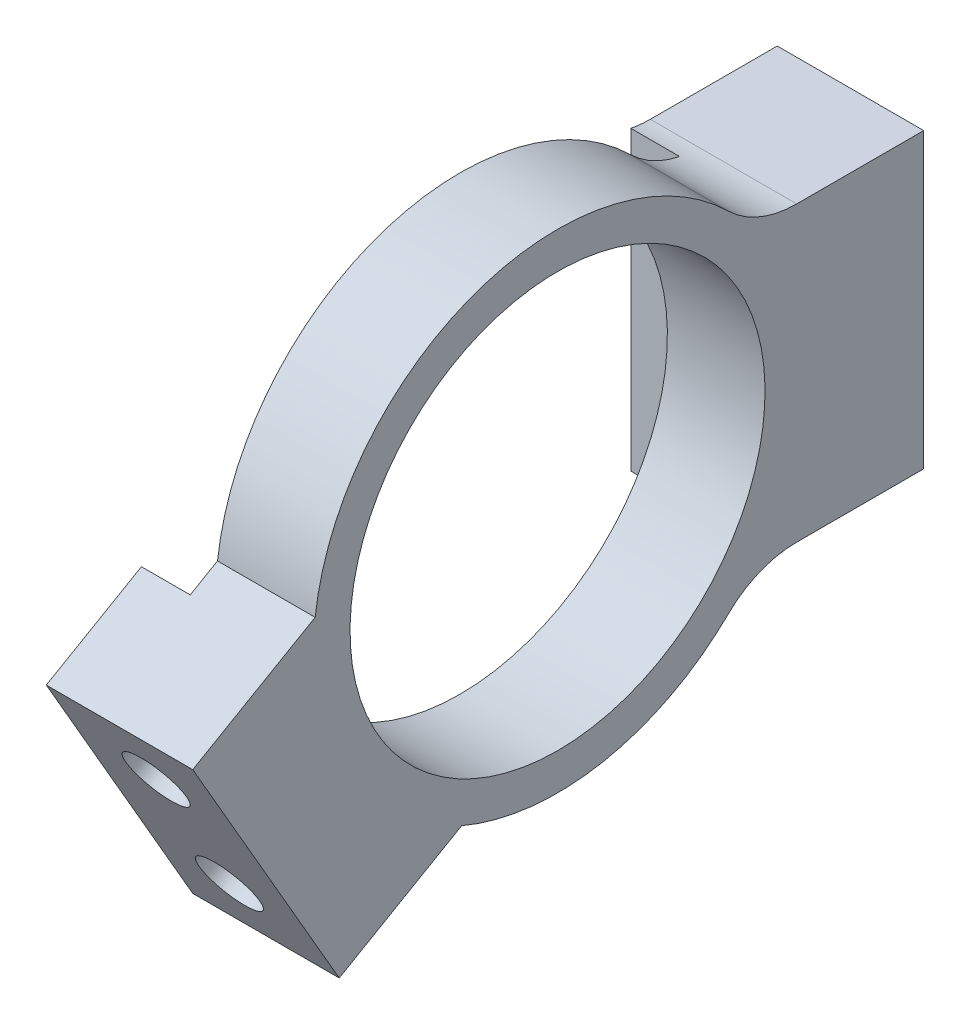
ISO-10303-21;
HEADER;
FILE_DESCRIPTION(('STEP AP214'),'2;1');
FILE_NAME('part.step','',(''),(''),'','','');
FILE_SCHEMA(('AUTOMOTIVE_DESIGN { 1 0 10303 214 1 1 1 1 }'));
ENDSEC;
DATA;
#1=APPLICATION_CONTEXT('core data for automotive mechanical design processes');
#2=APPLICATION_PROTOCOL_DEFINITION('international standard','automotive_design',2000,#1);
#3=PRODUCT_CONTEXT('',#1,'mechanical');
#4=PRODUCT('Part','Part','',(#3));
#5=PRODUCT_RELATED_PRODUCT_CATEGORY('part','',(#4));
#6=PRODUCT_DEFINITION_FORMATION('','',#4);
#7=PRODUCT_DEFINITION_CONTEXT('part definition',#1,'design');
#8=PRODUCT_DEFINITION('design','',#6,#7);
#9=PRODUCT_DEFINITION_SHAPE('','',#8);
#10=(LENGTH_UNIT() NAMED_UNIT(*) SI_UNIT(.MILLI.,.METRE.));
#11=(NAMED_UNIT(*) PLANE_ANGLE_UNIT() SI_UNIT($,.RADIAN.));
#12=(NAMED_UNIT(*) SI_UNIT($,.STERADIAN.) SOLID_ANGLE_UNIT());
#13=UNCERTAINTY_MEASURE_WITH_UNIT(LENGTH_MEASURE(1.E-05),#10,'distance_accuracy_value','');
#14=(GEOMETRIC_REPRESENTATION_CONTEXT(3) GLOBAL_UNCERTAINTY_ASSIGNED_CONTEXT((#13)) GLOBAL_UNIT_ASSIGNED_CONTEXT((#10,
#11,#12)) REPRESENTATION_CONTEXT('',''));
#15=CARTESIAN_POINT('',(0.,0.,0.));
#16=DIRECTION('',(0.,0.,1.));
#17=DIRECTION('',(1.,0.,0.));
#18=AXIS2_PLACEMENT_3D('',#15,#16,#17);
#19=CARTESIAN_POINT('',(-2.,4.3,7.));
#20=DIRECTION('',(1.,0.,0.));
#21=DIRECTION('',(0.,1.,0.));
#22=AXIS2_PLACEMENT_3D('',#19,#20,#21);
#23=PLANE('',#22);
#24=CARTESIAN_POINT('',(-2.,0.,15.));
#25=DIRECTION('',(-1.,0.,0.));
#26=DIRECTION('',(0.,-1.,0.));
#27=AXIS2_PLACEMENT_3D('',#24,#25,#26);
#28=CIRCLE('',#27,8.5);
#29=CARTESIAN_POINT('',(-2.,-8.5,15.));
#30=VERTEX_POINT('',#29);
#31=EDGE_CURVE('E180',#30,#30,#28,.T.);
#32=ORIENTED_EDGE('',*,*,#31,.F.);
#33=EDGE_LOOP('',(#32));
#34=FACE_BOUND('',#33,.T.);
#35=DIRECTION('',(0.,-0.866025403784439,-0.5));
#36=VECTOR('',#35,1.);
#37=CARTESIAN_POINT('',(-2.,0.551152422706631,26.0453760011574));
#38=LINE('',#37,#36);
#39=CARTESIAN_POINT('',(-2.,0.551152422706631,26.0453760011574));
#40=VERTEX_POINT('',#39);
#41=CARTESIAN_POINT('',(-2.,-9.84115242270664,20.0453760011574));
#42=VERTEX_POINT('',#41);
#43=EDGE_CURVE('E152',#40,#42,#38,.T.);
#44=ORIENTED_EDGE('',*,*,#43,.F.);
#45=DIRECTION('',(0.,0.5,-0.866025403784438));
#46=VECTOR('',#45,1.);
#47=CARTESIAN_POINT('',(-2.,-2.88750147344268,32.0012992589327));
#48=LINE('',#47,#46);
#49=CARTESIAN_POINT('',(-2.,1.19615242270663,24.9282032302755));
#50=VERTEX_POINT('',#49);
#51=EDGE_CURVE('E139',#40,#50,#48,.T.);
#52=ORIENTED_EDGE('',*,*,#51,.T.);
#53=CARTESIAN_POINT('',(-2.,0.,15.));
#54=DIRECTION('',(1.,0.,0.));
#55=DIRECTION('',(0.,1.,0.));
#56=AXIS2_PLACEMENT_3D('',#53,#54,#55);
#57=CIRCLE('',#56,10.);
#58=CARTESIAN_POINT('',(-2.,7.14285714285714,8.00145787776235));
#59=VERTEX_POINT('',#58);
#60=EDGE_CURVE('E187',#59,#50,#57,.T.);
#61=ORIENTED_EDGE('',*,*,#60,.F.);
#62=CARTESIAN_POINT('',(-2.,10.,5.20204102886729));
#63=DIRECTION('',(1.,0.,0.));
#64=DIRECTION('',(0.,1.,0.));
#65=AXIS2_PLACEMENT_3D('',#62,#63,#64);
#66=CIRCLE('',#65,4.);
#67=CARTESIAN_POINT('',(-2.,6.08040034182203,6.));
#68=VERTEX_POINT('',#67);
#69=EDGE_CURVE('E241',#59,#68,#66,.T.);
#70=ORIENTED_EDGE('',*,*,#69,.T.);
#71=DIRECTION('',(0.,-1.,0.));
#72=VECTOR('',#71,1.);
#73=CARTESIAN_POINT('',(-2.,4.3,6.));
#74=LINE('',#73,#72);
#75=CARTESIAN_POINT('',(-2.,-6.08040034182203,6.));
#76=VERTEX_POINT('',#75);
#77=EDGE_CURVE('E203',#68,#76,#74,.T.);
#78=ORIENTED_EDGE('',*,*,#77,.T.);
#79=CARTESIAN_POINT('',(-2.,-10.,5.20204102886729));
#80=DIRECTION('',(1.,0.,0.));
#81=DIRECTION('',(0.,1.,0.));
#82=AXIS2_PLACEMENT_3D('',#79,#80,#81);
#83=CIRCLE('',#82,4.);
#84=CARTESIAN_POINT('',(-2.,-7.14285714285714,8.00145787776235));
#85=VERTEX_POINT('',#84);
#86=EDGE_CURVE('E11',#76,#85,#83,.T.);
#87=ORIENTED_EDGE('',*,*,#86,.T.);
#88=CARTESIAN_POINT('',(-2.,-9.19615242270664,18.9282032302755));
#89=VERTEX_POINT('',#88);
#90=EDGE_CURVE('E190',#89,#85,#57,.T.);
#91=ORIENTED_EDGE('',*,*,#90,.F.);
#92=DIRECTION('',(0.,0.5,-0.866025403784439));
#93=VECTOR('',#92,1.);
#94=CARTESIAN_POINT('',(-2.,-13.2798063188559,26.0012992589327));
#95=LINE('',#94,#93);
#96=EDGE_CURVE('E51',#42,#89,#95,.T.);
#97=ORIENTED_EDGE('',*,*,#96,.F.);
#98=EDGE_LOOP('',(#44,#52,#61,#70,#78,#87,#91,#97));
#99=FACE_BOUND('',#98,.T.);
#100=ADVANCED_FACE('F36',(#34,#99),#23,.F.);
#101=CARTESIAN_POINT('',(-2.,0.,15.));
#102=DIRECTION('',(1.,0.,0.));
#103=DIRECTION('',(0.,1.,0.));
#104=AXIS2_PLACEMENT_3D('',#101,#102,#103);
#105=CYLINDRICAL_SURFACE('',#104,10.);
#106=CARTESIAN_POINT('',(2.,0.,15.));
#107=DIRECTION('',(1.,0.,0.));
#108=DIRECTION('',(0.,1.,0.));
#109=AXIS2_PLACEMENT_3D('',#106,#107,#108);
#110=CIRCLE('',#109,10.);
#111=CARTESIAN_POINT('',(2.,-9.19615242270664,18.9282032302755));
#112=VERTEX_POINT('',#111);
#113=CARTESIAN_POINT('',(2.,-7.14285714285714,8.00145787776235));
#114=VERTEX_POINT('',#113);
#115=EDGE_CURVE('E186',#112,#114,#110,.T.);
#116=ORIENTED_EDGE('',*,*,#115,.F.);
#117=DIRECTION('',(-1.,0.,0.));
#118=VECTOR('',#117,1.);
#119=CARTESIAN_POINT('',(19.2588235436221,-9.19615242270663,18.9282032302755));
#120=LINE('',#119,#118);
#121=EDGE_CURVE('E58',#112,#89,#120,.T.);
#122=ORIENTED_EDGE('',*,*,#121,.T.);
#123=ORIENTED_EDGE('',*,*,#90,.T.);
#124=DIRECTION('',(1.,0.,0.));
#125=VECTOR('',#124,1.);
#126=CARTESIAN_POINT('',(-2.,-7.14285714285714,8.00145787776235));
#127=LINE('',#126,#125);
#128=EDGE_CURVE('E232',#85,#114,#127,.T.);
#129=ORIENTED_EDGE('',*,*,#128,.T.);
#130=EDGE_LOOP('',(#116,#122,#123,#129));
#131=FACE_BOUND('',#130,.T.);
#132=ADVANCED_FACE('F290',(#131),#105,.T.);
#133=CARTESIAN_POINT('',(-4.,-6.,6.));
#134=DIRECTION('',(0.,0.,1.));
#135=DIRECTION('',(1.,0.,0.));
#136=AXIS2_PLACEMENT_3D('',#133,#134,#135);
#137=PLANE('',#136);
#138=DIRECTION('',(0.,-1.,0.));
#139=VECTOR('',#138,1.);
#140=CARTESIAN_POINT('',(-4.,6.,6.));
#141=LINE('',#140,#139);
#142=CARTESIAN_POINT('',(-4.,6.08040034182203,6.));
#143=VERTEX_POINT('',#142);
#144=CARTESIAN_POINT('',(-4.,-6.08040034182203,6.));
#145=VERTEX_POINT('',#144);
#146=EDGE_CURVE('E208',#143,#145,#141,.T.);
#147=ORIENTED_EDGE('',*,*,#146,.T.);
#148=DIRECTION('',(1.,0.,0.));
#149=VECTOR('',#148,1.);
#150=CARTESIAN_POINT('',(-4.,-6.08040034182203,6.));
#151=LINE('',#150,#149);
#152=EDGE_CURVE('E44',#145,#76,#151,.T.);
#153=ORIENTED_EDGE('',*,*,#152,.T.);
#154=ORIENTED_EDGE('',*,*,#77,.F.);
#155=DIRECTION('',(1.,0.,0.));
#156=VECTOR('',#155,1.);
#157=CARTESIAN_POINT('',(-2.,6.08040034182203,6.));
#158=LINE('',#157,#156);
#159=EDGE_CURVE('E244',#68,#143,#158,.F.);
#160=ORIENTED_EDGE('',*,*,#159,.T.);
#161=EDGE_LOOP('',(#147,#153,#154,#160));
#162=FACE_BOUND('',#161,.T.);
#163=ADVANCED_FACE('F257',(#162),#137,.T.);
#164=CARTESIAN_POINT('',(-4.,6.,6.));
#165=DIRECTION('',(1.,0.,0.));
#166=DIRECTION('',(0.,1.,0.));
#167=AXIS2_PLACEMENT_3D('',#164,#165,#166);
#168=PLANE('',#167);
#169=DIRECTION('',(0.,-1.,0.));
#170=VECTOR('',#169,1.);
#171=CARTESIAN_POINT('',(-4.,6.,0.));
#172=LINE('',#171,#170);
#173=CARTESIAN_POINT('',(-4.,6.,0.));
#174=VERTEX_POINT('',#173);
#175=CARTESIAN_POINT('',(-4.,-6.,0.));
#176=VERTEX_POINT('',#175);
#177=EDGE_CURVE('E207',#174,#176,#172,.T.);
#178=ORIENTED_EDGE('',*,*,#177,.T.);
#179=DIRECTION('',(0.,0.,-1.));
#180=VECTOR('',#179,1.);
#181=CARTESIAN_POINT('',(-4.,-6.,6.));
#182=LINE('',#181,#180);
#183=CARTESIAN_POINT('',(-4.,-6.,5.20204102886729));
#184=VERTEX_POINT('',#183);
#185=EDGE_CURVE('E227',#184,#176,#182,.T.);
#186=ORIENTED_EDGE('',*,*,#185,.F.);
#187=CARTESIAN_POINT('',(-4.,-10.,5.20204102886729));
#188=DIRECTION('',(1.,0.,0.));
#189=DIRECTION('',(0.,1.,0.));
#190=AXIS2_PLACEMENT_3D('',#187,#188,#189);
#191=CIRCLE('',#190,4.);
#192=EDGE_CURVE('E251',#184,#145,#191,.T.);
#193=ORIENTED_EDGE('',*,*,#192,.T.);
#194=ORIENTED_EDGE('',*,*,#146,.F.);
#195=CARTESIAN_POINT('',(-4.,10.,5.20204102886729));
#196=DIRECTION('',(1.,0.,0.));
#197=DIRECTION('',(0.,1.,0.));
#198=AXIS2_PLACEMENT_3D('',#195,#196,#197);
#199=CIRCLE('',#198,4.);
#200=CARTESIAN_POINT('',(-4.,6.,5.20204102886729));
#201=VERTEX_POINT('',#200);
#202=EDGE_CURVE('E247',#143,#201,#199,.T.);
#203=ORIENTED_EDGE('',*,*,#202,.T.);
#204=DIRECTION('',(0.,0.,-1.));
#205=VECTOR('',#204,1.);
#206=CARTESIAN_POINT('',(-4.,6.,6.));
#207=LINE('',#206,#205);
#208=EDGE_CURVE('E210',#201,#174,#207,.T.);
#209=ORIENTED_EDGE('',*,*,#208,.T.);
#210=EDGE_LOOP('',(#178,#186,#193,#194,#203,#209));
#211=FACE_BOUND('',#210,.T.);
#212=ADVANCED_FACE('F271',(#211),#168,.F.);
#213=CARTESIAN_POINT('',(-4.,-6.,6.));
#214=DIRECTION('',(0.,1.,0.));
#215=DIRECTION('',(0.,0.,1.));
#216=AXIS2_PLACEMENT_3D('',#213,#214,#215);
#217=PLANE('',#216);
#218=DIRECTION('',(0.,0.,-1.));
#219=VECTOR('',#218,1.);
#220=CARTESIAN_POINT('',(2.,-6.,6.));
#221=LINE('',#220,#219);
#222=CARTESIAN_POINT('',(2.,-6.,5.20204102886729));
#223=VERTEX_POINT('',#222);
#224=CARTESIAN_POINT('',(2.,-6.,0.));
#225=VERTEX_POINT('',#224);
#226=EDGE_CURVE('E225',#223,#225,#221,.T.);
#227=ORIENTED_EDGE('',*,*,#226,.F.);
#228=DIRECTION('',(1.,0.,0.));
#229=VECTOR('',#228,1.);
#230=CARTESIAN_POINT('',(-4.,-6.,5.20204102886729));
#231=LINE('',#230,#229);
#232=EDGE_CURVE('E237',#223,#184,#231,.F.);
#233=ORIENTED_EDGE('',*,*,#232,.T.);
#234=ORIENTED_EDGE('',*,*,#185,.T.);
#235=DIRECTION('',(1.,0.,0.));
#236=VECTOR('',#235,1.);
#237=CARTESIAN_POINT('',(-4.,-6.,0.));
#238=LINE('',#237,#236);
#239=EDGE_CURVE('E214',#176,#225,#238,.T.);
#240=ORIENTED_EDGE('',*,*,#239,.T.);
#241=EDGE_LOOP('',(#227,#233,#234,#240));
#242=FACE_BOUND('',#241,.T.);
#243=ADVANCED_FACE('F285',(#242),#217,.F.);
#244=CARTESIAN_POINT('',(2.,6.,6.));
#245=DIRECTION('',(-1.,0.,0.));
#246=DIRECTION('',(0.,-1.,0.));
#247=AXIS2_PLACEMENT_3D('',#244,#245,#246);
#248=PLANE('',#247);
#249=CARTESIAN_POINT('',(2.,0.,15.));
#250=DIRECTION('',(-1.,0.,0.));
#251=DIRECTION('',(0.,-1.,0.));
#252=AXIS2_PLACEMENT_3D('',#249,#250,#251);
#253=CIRCLE('',#252,8.5);
#254=CARTESIAN_POINT('',(2.,-8.5,15.));
#255=VERTEX_POINT('',#254);
#256=EDGE_CURVE('E183',#255,#255,#253,.F.);
#257=ORIENTED_EDGE('',*,*,#256,.F.);
#258=EDGE_LOOP('',(#257));
#259=FACE_BOUND('',#258,.T.);
#260=DIRECTION('',(0.,0.,-1.));
#261=VECTOR('',#260,1.);
#262=CARTESIAN_POINT('',(2.,6.,6.));
#263=LINE('',#262,#261);
#264=CARTESIAN_POINT('',(2.,6.,5.20204102886729));
#265=VERTEX_POINT('',#264);
#266=CARTESIAN_POINT('',(2.,6.,0.));
#267=VERTEX_POINT('',#266);
#268=EDGE_CURVE('E223',#265,#267,#263,.T.);
#269=ORIENTED_EDGE('',*,*,#268,.F.);
#270=CARTESIAN_POINT('',(2.,10.,5.20204102886729));
#271=DIRECTION('',(-1.,0.,0.));
#272=DIRECTION('',(0.,-1.,0.));
#273=AXIS2_PLACEMENT_3D('',#270,#271,#272);
#274=CIRCLE('',#273,4.);
#275=CARTESIAN_POINT('',(2.,7.14285714285714,8.00145787776235));
#276=VERTEX_POINT('',#275);
#277=EDGE_CURVE('E239',#265,#276,#274,.T.);
#278=ORIENTED_EDGE('',*,*,#277,.T.);
#279=CARTESIAN_POINT('',(2.,1.19615242270663,24.9282032302755));
#280=VERTEX_POINT('',#279);
#281=EDGE_CURVE('E191',#276,#280,#110,.T.);
#282=ORIENTED_EDGE('',*,*,#281,.T.);
#283=DIRECTION('',(0.,-0.5,0.866025403784438));
#284=VECTOR('',#283,1.);
#285=CARTESIAN_POINT('',(2.,-2.88750147344268,32.0012992589327));
#286=LINE('',#285,#284);
#287=CARTESIAN_POINT('',(2.,-1.69884757729337,29.9424903181874));
#288=VERTEX_POINT('',#287);
#289=EDGE_CURVE('E171',#280,#288,#286,.T.);
#290=ORIENTED_EDGE('',*,*,#289,.T.);
#291=DIRECTION('',(0.,0.866025403784438,0.5));
#292=VECTOR('',#291,1.);
#293=CARTESIAN_POINT('',(2.,-26.4387261363955,15.6589147723711));
#294=LINE('',#293,#292);
#295=CARTESIAN_POINT('',(2.,-12.0911524227066,23.9424903181874));
#296=VERTEX_POINT('',#295);
#297=EDGE_CURVE('E168',#296,#288,#294,.T.);
#298=ORIENTED_EDGE('',*,*,#297,.F.);
#299=DIRECTION('',(0.,-0.5,0.866025403784439));
#300=VECTOR('',#299,1.);
#301=CARTESIAN_POINT('',(2.,-13.2798063188559,26.0012992589327));
#302=LINE('',#301,#300);
#303=EDGE_CURVE('E166',#112,#296,#302,.T.);
#304=ORIENTED_EDGE('',*,*,#303,.F.);
#305=ORIENTED_EDGE('',*,*,#115,.T.);
#306=CARTESIAN_POINT('',(2.,-10.,5.20204102886729));
#307=DIRECTION('',(-1.,0.,0.));
#308=DIRECTION('',(0.,-1.,0.));
#309=AXIS2_PLACEMENT_3D('',#306,#307,#308);
#310=CIRCLE('',#309,4.);
#311=EDGE_CURVE('E249',#114,#223,#310,.T.);
#312=ORIENTED_EDGE('',*,*,#311,.T.);
#313=ORIENTED_EDGE('',*,*,#226,.T.);
#314=DIRECTION('',(0.,1.,0.));
#315=VECTOR('',#314,1.);
#316=CARTESIAN_POINT('',(2.,6.,0.));
#317=LINE('',#316,#315);
#318=EDGE_CURVE('E217',#225,#267,#317,.T.);
#319=ORIENTED_EDGE('',*,*,#318,.T.);
#320=EDGE_LOOP('',(#269,#278,#282,#290,#298,#304,#305,#312,#313,#319));
#321=FACE_BOUND('',#320,.T.);
#322=ADVANCED_FACE('F287',(#259,#321),#248,.F.);
#323=CARTESIAN_POINT('',(-4.,6.,6.));
#324=DIRECTION('',(0.,-1.,0.));
#325=DIRECTION('',(0.,0.,-1.));
#326=AXIS2_PLACEMENT_3D('',#323,#324,#325);
#327=PLANE('',#326);
#328=ORIENTED_EDGE('',*,*,#208,.F.);
#329=DIRECTION('',(1.,0.,0.));
#330=VECTOR('',#329,1.);
#331=CARTESIAN_POINT('',(-4.,6.,5.20204102886729));
#332=LINE('',#331,#330);
#333=EDGE_CURVE('E229',#201,#265,#332,.T.);
#334=ORIENTED_EDGE('',*,*,#333,.T.);
#335=ORIENTED_EDGE('',*,*,#268,.T.);
#336=DIRECTION('',(-1.,0.,0.));
#337=VECTOR('',#336,1.);
#338=CARTESIAN_POINT('',(-4.,6.,0.));
#339=LINE('',#338,#337);
#340=EDGE_CURVE('E211',#267,#174,#339,.T.);
#341=ORIENTED_EDGE('',*,*,#340,.T.);
#342=EDGE_LOOP('',(#328,#334,#335,#341));
#343=FACE_BOUND('',#342,.T.);
#344=ADVANCED_FACE('F273',(#343),#327,.F.);
#345=CARTESIAN_POINT('',(-4.,-6.,0.));
#346=DIRECTION('',(0.,0.,1.));
#347=DIRECTION('',(1.,0.,0.));
#348=AXIS2_PLACEMENT_3D('',#345,#346,#347);
#349=PLANE('',#348);
#350=CARTESIAN_POINT('',(-1.,-3.,0.));
#351=DIRECTION('',(0.,0.,-1.));
#352=DIRECTION('',(-1.,0.,0.));
#353=AXIS2_PLACEMENT_3D('',#350,#351,#352);
#354=CIRCLE('',#353,1.25);
#355=CARTESIAN_POINT('',(-2.25,-3.,0.));
#356=VERTEX_POINT('',#355);
#357=EDGE_CURVE('E189',#356,#356,#354,.T.);
#358=ORIENTED_EDGE('',*,*,#357,.F.);
#359=EDGE_LOOP('',(#358));
#360=FACE_BOUND('',#359,.T.);
#361=CARTESIAN_POINT('',(-1.,3.,0.));
#362=DIRECTION('',(0.,0.,-1.));
#363=DIRECTION('',(-1.,0.,0.));
#364=AXIS2_PLACEMENT_3D('',#361,#362,#363);
#365=CIRCLE('',#364,1.25);
#366=CARTESIAN_POINT('',(-2.25,3.,0.));
#367=VERTEX_POINT('',#366);
#368=EDGE_CURVE('E197',#367,#367,#365,.T.);
#369=ORIENTED_EDGE('',*,*,#368,.F.);
#370=EDGE_LOOP('',(#369));
#371=FACE_BOUND('',#370,.T.);
#372=ORIENTED_EDGE('',*,*,#177,.F.);
#373=ORIENTED_EDGE('',*,*,#340,.F.);
#374=ORIENTED_EDGE('',*,*,#318,.F.);
#375=ORIENTED_EDGE('',*,*,#239,.F.);
#376=EDGE_LOOP('',(#372,#373,#374,#375));
#377=FACE_BOUND('',#376,.T.);
#378=ADVANCED_FACE('F280',(#360,#371,#377),#349,.F.);
#379=CARTESIAN_POINT('',(-1.,3.,5.5));
#380=DIRECTION('',(0.,0.,-1.));
#381=DIRECTION('',(-1.,0.,0.));
#382=AXIS2_PLACEMENT_3D('',#379,#380,#381);
#383=CYLINDRICAL_SURFACE('',#382,1.25);
#384=CARTESIAN_POINT('',(-1.,3.,5.5));
#385=DIRECTION('',(0.,0.,-1.));
#386=DIRECTION('',(-1.,0.,0.));
#387=AXIS2_PLACEMENT_3D('',#384,#385,#386);
#388=CIRCLE('',#387,1.25);
#389=CARTESIAN_POINT('',(-2.25,3.,5.5));
#390=VERTEX_POINT('',#389);
#391=EDGE_CURVE('E200',#390,#390,#388,.T.);
#392=ORIENTED_EDGE('',*,*,#391,.F.);
#393=EDGE_LOOP('',(#392));
#394=FACE_BOUND('',#393,.T.);
#395=ORIENTED_EDGE('',*,*,#368,.T.);
#396=EDGE_LOOP('',(#395));
#397=FACE_BOUND('',#396,.T.);
#398=ADVANCED_FACE('F428',(#394,#397),#383,.F.);
#399=CARTESIAN_POINT('',(-1.,3.,5.5));
#400=DIRECTION('',(0.,0.,-1.));
#401=DIRECTION('',(-1.,0.,0.));
#402=AXIS2_PLACEMENT_3D('',#399,#400,#401);
#403=PLANE('',#402);
#404=ORIENTED_EDGE('',*,*,#391,.T.);
#405=EDGE_LOOP('',(#404));
#406=FACE_BOUND('',#405,.T.);
#407=ADVANCED_FACE('F433',(#406),#403,.T.);
#408=CARTESIAN_POINT('',(-1.,-3.,5.5));
#409=DIRECTION('',(0.,0.,-1.));
#410=DIRECTION('',(-1.,0.,0.));
#411=AXIS2_PLACEMENT_3D('',#408,#409,#410);
#412=CYLINDRICAL_SURFACE('',#411,1.25);
#413=CARTESIAN_POINT('',(-1.,-3.,5.5));
#414=DIRECTION('',(0.,0.,-1.));
#415=DIRECTION('',(-1.,0.,0.));
#416=AXIS2_PLACEMENT_3D('',#413,#414,#415);
#417=CIRCLE('',#416,1.25);
#418=CARTESIAN_POINT('',(-2.25,-3.,5.5));
#419=VERTEX_POINT('',#418);
#420=EDGE_CURVE('E194',#419,#419,#417,.T.);
#421=ORIENTED_EDGE('',*,*,#420,.F.);
#422=EDGE_LOOP('',(#421));
#423=FACE_BOUND('',#422,.T.);
#424=ORIENTED_EDGE('',*,*,#357,.T.);
#425=EDGE_LOOP('',(#424));
#426=FACE_BOUND('',#425,.T.);
#427=ADVANCED_FACE('F312',(#423,#426),#412,.F.);
#428=CARTESIAN_POINT('',(-1.,-3.,5.5));
#429=DIRECTION('',(0.,0.,-1.));
#430=DIRECTION('',(-1.,0.,0.));
#431=AXIS2_PLACEMENT_3D('',#428,#429,#430);
#432=PLANE('',#431);
#433=ORIENTED_EDGE('',*,*,#420,.T.);
#434=EDGE_LOOP('',(#433));
#435=FACE_BOUND('',#434,.T.);
#436=ADVANCED_FACE('F305',(#435),#432,.T.);
#437=DIRECTION('',(-1.,0.,0.));
#438=VECTOR('',#437,1.);
#439=CARTESIAN_POINT('',(19.2588235436221,1.19615242270663,24.9282032302755));
#440=LINE('',#439,#438);
#441=EDGE_CURVE('E146',#280,#50,#440,.T.);
#442=ORIENTED_EDGE('',*,*,#441,.F.);
#443=ORIENTED_EDGE('',*,*,#281,.F.);
#444=DIRECTION('',(1.,0.,0.));
#445=VECTOR('',#444,1.);
#446=CARTESIAN_POINT('',(-2.,7.14285714285714,8.00145787776235));
#447=LINE('',#446,#445);
#448=EDGE_CURVE('E235',#276,#59,#447,.F.);
#449=ORIENTED_EDGE('',*,*,#448,.T.);
#450=ORIENTED_EDGE('',*,*,#60,.T.);
#451=EDGE_LOOP('',(#442,#443,#449,#450));
#452=FACE_BOUND('',#451,.T.);
#453=ADVANCED_FACE('F293',(#452),#105,.T.);
#454=CARTESIAN_POINT('',(26.0416305603426,0.,15.));
#455=DIRECTION('',(-1.,0.,0.));
#456=DIRECTION('',(0.,-1.,0.));
#457=AXIS2_PLACEMENT_3D('',#454,#455,#456);
#458=CYLINDRICAL_SURFACE('',#457,8.5);
#459=ORIENTED_EDGE('',*,*,#256,.T.);
#460=EDGE_LOOP('',(#459));
#461=FACE_BOUND('',#460,.T.);
#462=ORIENTED_EDGE('',*,*,#31,.T.);
#463=EDGE_LOOP('',(#462));
#464=FACE_BOUND('',#463,.T.);
#465=ADVANCED_FACE('F304',(#461,#464),#458,.F.);
#466=CARTESIAN_POINT('',(-2.,10.,5.20204102886729));
#467=DIRECTION('',(1.,0.,0.));
#468=DIRECTION('',(0.,1.,0.));
#469=AXIS2_PLACEMENT_3D('',#466,#467,#468);
#470=CYLINDRICAL_SURFACE('',#469,4.);
#471=ORIENTED_EDGE('',*,*,#69,.F.);
#472=ORIENTED_EDGE('',*,*,#448,.F.);
#473=ORIENTED_EDGE('',*,*,#277,.F.);
#474=ORIENTED_EDGE('',*,*,#333,.F.);
#475=ORIENTED_EDGE('',*,*,#202,.F.);
#476=ORIENTED_EDGE('',*,*,#159,.F.);
#477=EDGE_LOOP('',(#471,#472,#473,#474,#475,#476));
#478=FACE_BOUND('',#477,.T.);
#479=ADVANCED_FACE('F267',(#478),#470,.F.);
#480=CARTESIAN_POINT('',(-2.,-10.,5.20204102886729));
#481=DIRECTION('',(1.,0.,0.));
#482=DIRECTION('',(0.,1.,0.));
#483=AXIS2_PLACEMENT_3D('',#480,#481,#482);
#484=CYLINDRICAL_SURFACE('',#483,4.);
#485=ORIENTED_EDGE('',*,*,#192,.F.);
#486=ORIENTED_EDGE('',*,*,#232,.F.);
#487=ORIENTED_EDGE('',*,*,#311,.F.);
#488=ORIENTED_EDGE('',*,*,#128,.F.);
#489=ORIENTED_EDGE('',*,*,#86,.F.);
#490=ORIENTED_EDGE('',*,*,#152,.F.);
#491=EDGE_LOOP('',(#485,#486,#487,#488,#489,#490));
#492=FACE_BOUND('',#491,.T.);
#493=ADVANCED_FACE('F38',(#492),#484,.F.);
#494=CARTESIAN_POINT('',(19.2588235436221,-26.4387261363955,15.6589147723711));
#495=DIRECTION('',(0.,0.5,-0.866025403784438));
#496=DIRECTION('',(0.,0.866025403784438,0.5));
#497=AXIS2_PLACEMENT_3D('',#494,#495,#496);
#498=PLANE('',#497);
#499=CARTESIAN_POINT('',(-1.,-4.2969237886467,28.4424903181874));
#500=DIRECTION('',(0.,-0.500000000000001,0.866025403784438));
#501=DIRECTION('',(0.,-0.866025403784438,-0.500000000000001));
#502=AXIS2_PLACEMENT_3D('',#499,#500,#501);
#503=CIRCLE('',#502,1.25);
#504=CARTESIAN_POINT('',(-1.,-5.37945554337724,27.8174903181874));
#505=VERTEX_POINT('',#504);
#506=EDGE_CURVE('E333',#505,#505,#503,.T.);
#507=ORIENTED_EDGE('',*,*,#506,.F.);
#508=EDGE_LOOP('',(#507));
#509=FACE_BOUND('',#508,.T.);
#510=CARTESIAN_POINT('',(-1.,-9.49307621135332,25.4424903181874));
#511=DIRECTION('',(0.,-0.500000000000001,0.866025403784438));
#512=DIRECTION('',(0.,-0.866025403784438,-0.500000000000001));
#513=AXIS2_PLACEMENT_3D('',#510,#511,#512);
#514=CIRCLE('',#513,1.25);
#515=CARTESIAN_POINT('',(-1.,-10.5756079660839,24.8174903181874));
#516=VERTEX_POINT('',#515);
#517=EDGE_CURVE('E327',#516,#516,#514,.T.);
#518=ORIENTED_EDGE('',*,*,#517,.F.);
#519=EDGE_LOOP('',(#518));
#520=FACE_BOUND('',#519,.T.);
#521=DIRECTION('',(-1.,0.,0.));
#522=VECTOR('',#521,1.);
#523=CARTESIAN_POINT('',(19.2588235436221,-12.0911524227066,23.9424903181874));
#524=LINE('',#523,#522);
#525=CARTESIAN_POINT('',(-4.,-12.0911524227066,23.9424903181874));
#526=VERTEX_POINT('',#525);
#527=EDGE_CURVE('E169',#296,#526,#524,.T.);
#528=ORIENTED_EDGE('',*,*,#527,.F.);
#529=ORIENTED_EDGE('',*,*,#297,.T.);
#530=DIRECTION('',(-1.,0.,0.));
#531=VECTOR('',#530,1.);
#532=CARTESIAN_POINT('',(19.2588235436221,-1.69884757729337,29.9424903181874));
#533=LINE('',#532,#531);
#534=CARTESIAN_POINT('',(-4.,-1.69884757729337,29.9424903181874));
#535=VERTEX_POINT('',#534);
#536=EDGE_CURVE('E174',#288,#535,#533,.T.);
#537=ORIENTED_EDGE('',*,*,#536,.T.);
#538=DIRECTION('',(0.,-0.866025403784439,-0.5));
#539=VECTOR('',#538,1.);
#540=CARTESIAN_POINT('',(-4.,-12.0911524227066,23.9424903181874));
#541=LINE('',#540,#539);
#542=EDGE_CURVE('E149',#535,#526,#541,.T.);
#543=ORIENTED_EDGE('',*,*,#542,.T.);
#544=EDGE_LOOP('',(#528,#529,#537,#543));
#545=FACE_BOUND('',#544,.T.);
#546=ADVANCED_FACE('F318',(#509,#520,#545),#498,.F.);
#547=CARTESIAN_POINT('',(19.2588235436221,-13.2798063188559,26.0012992589327));
#548=DIRECTION('',(0.,0.866025403784439,0.5));
#549=DIRECTION('',(0.,-0.5,0.866025403784439));
#550=AXIS2_PLACEMENT_3D('',#547,#548,#549);
#551=PLANE('',#550);
#552=ORIENTED_EDGE('',*,*,#121,.F.);
#553=ORIENTED_EDGE('',*,*,#303,.T.);
#554=ORIENTED_EDGE('',*,*,#527,.T.);
#555=DIRECTION('',(0.,0.499999999999999,-0.866025403784439));
#556=VECTOR('',#555,1.);
#557=CARTESIAN_POINT('',(-4.,-9.84115242270664,20.0453760011574));
#558=LINE('',#557,#556);
#559=CARTESIAN_POINT('',(-4.,-9.84115242270664,20.0453760011574));
#560=VERTEX_POINT('',#559);
#561=EDGE_CURVE('E160',#526,#560,#558,.T.);
#562=ORIENTED_EDGE('',*,*,#561,.T.);
#563=DIRECTION('',(1.,0.,0.));
#564=VECTOR('',#563,1.);
#565=CARTESIAN_POINT('',(-20.0555518001942,-9.84115242270664,20.0453760011574));
#566=LINE('',#565,#564);
#567=EDGE_CURVE('E155',#560,#42,#566,.T.);
#568=ORIENTED_EDGE('',*,*,#567,.T.);
#569=ORIENTED_EDGE('',*,*,#96,.T.);
#570=EDGE_LOOP('',(#552,#553,#554,#562,#568,#569));
#571=FACE_BOUND('',#570,.T.);
#572=ADVANCED_FACE('F350',(#571),#551,.F.);
#573=CARTESIAN_POINT('',(19.2588235436221,-2.88750147344268,32.0012992589327));
#574=DIRECTION('',(0.,0.866025403784438,0.5));
#575=DIRECTION('',(0.,-0.5,0.866025403784438));
#576=AXIS2_PLACEMENT_3D('',#573,#574,#575);
#577=PLANE('',#576);
#578=ORIENTED_EDGE('',*,*,#289,.F.);
#579=ORIENTED_EDGE('',*,*,#441,.T.);
#580=ORIENTED_EDGE('',*,*,#51,.F.);
#581=DIRECTION('',(1.,0.,0.));
#582=VECTOR('',#581,1.);
#583=CARTESIAN_POINT('',(-20.0555518001942,0.55115242270663,26.0453760011574));
#584=LINE('',#583,#582);
#585=CARTESIAN_POINT('',(-4.,0.551152422706631,26.0453760011574));
#586=VERTEX_POINT('',#585);
#587=EDGE_CURVE('E143',#586,#40,#584,.T.);
#588=ORIENTED_EDGE('',*,*,#587,.F.);
#589=DIRECTION('',(0.,-0.5,0.866025403784439));
#590=VECTOR('',#589,1.);
#591=CARTESIAN_POINT('',(-4.,-1.69884757729337,29.9424903181874));
#592=LINE('',#591,#590);
#593=EDGE_CURVE('E321',#586,#535,#592,.T.);
#594=ORIENTED_EDGE('',*,*,#593,.T.);
#595=ORIENTED_EDGE('',*,*,#536,.F.);
#596=EDGE_LOOP('',(#578,#579,#580,#588,#594,#595));
#597=FACE_BOUND('',#596,.T.);
#598=ADVANCED_FACE('F140',(#597),#577,.T.);
#599=CARTESIAN_POINT('',(-20.0555518001942,0.55115242270663,26.0453760011574));
#600=DIRECTION('',(0.,-0.5,0.866025403784439));
#601=DIRECTION('',(0.,-0.866025403784439,-0.5));
#602=AXIS2_PLACEMENT_3D('',#599,#600,#601);
#603=PLANE('',#602);
#604=ORIENTED_EDGE('',*,*,#567,.F.);
#605=DIRECTION('',(0.,0.866025403784439,0.5));
#606=VECTOR('',#605,1.);
#607=CARTESIAN_POINT('',(-4.,0.551152422706633,26.0453760011574));
#608=LINE('',#607,#606);
#609=EDGE_CURVE('E159',#560,#586,#608,.T.);
#610=ORIENTED_EDGE('',*,*,#609,.T.);
#611=ORIENTED_EDGE('',*,*,#587,.T.);
#612=ORIENTED_EDGE('',*,*,#43,.T.);
#613=EDGE_LOOP('',(#604,#610,#611,#612));
#614=FACE_BOUND('',#613,.T.);
#615=ADVANCED_FACE('F158',(#614),#603,.F.);
#616=CARTESIAN_POINT('',(-4.,6.,6.));
#617=DIRECTION('',(1.,0.,0.));
#618=DIRECTION('',(0.,1.,0.));
#619=AXIS2_PLACEMENT_3D('',#616,#617,#618);
#620=PLANE('',#619);
#621=ORIENTED_EDGE('',*,*,#593,.F.);
#622=ORIENTED_EDGE('',*,*,#609,.F.);
#623=ORIENTED_EDGE('',*,*,#561,.F.);
#624=ORIENTED_EDGE('',*,*,#542,.F.);
#625=EDGE_LOOP('',(#621,#622,#623,#624));
#626=FACE_BOUND('',#625,.T.);
#627=ADVANCED_FACE('F356',(#626),#620,.F.);
#628=CARTESIAN_POINT('',(-1.,-7.49307621135332,21.9783887030496));
#629=DIRECTION('',(0.,-0.500000000000001,0.866025403784438));
#630=DIRECTION('',(0.,-0.866025403784438,-0.500000000000001));
#631=AXIS2_PLACEMENT_3D('',#628,#629,#630);
#632=CYLINDRICAL_SURFACE('',#631,1.25);
#633=CARTESIAN_POINT('',(-1.,-7.49307621135332,21.9783887030496));
#634=DIRECTION('',(0.,-0.500000000000001,0.866025403784438));
#635=DIRECTION('',(0.,-0.866025403784438,-0.500000000000001));
#636=AXIS2_PLACEMENT_3D('',#633,#634,#635);
#637=CIRCLE('',#636,1.25);
#638=CARTESIAN_POINT('',(-1.,-8.57560796608387,21.3533887030496));
#639=VERTEX_POINT('',#638);
#640=EDGE_CURVE('E156',#639,#639,#637,.T.);
#641=ORIENTED_EDGE('',*,*,#640,.F.);
#642=EDGE_LOOP('',(#641));
#643=FACE_BOUND('',#642,.T.);
#644=ORIENTED_EDGE('',*,*,#517,.T.);
#645=EDGE_LOOP('',(#644));
#646=FACE_BOUND('',#645,.T.);
#647=ADVANCED_FACE('F354',(#643,#646),#632,.F.);
#648=CARTESIAN_POINT('',(-1.,-7.49307621135332,21.9783887030496));
#649=DIRECTION('',(0.,-0.500000000000001,0.866025403784438));
#650=DIRECTION('',(0.,-0.866025403784438,-0.500000000000001));
#651=AXIS2_PLACEMENT_3D('',#648,#649,#650);
#652=PLANE('',#651);
#653=ORIENTED_EDGE('',*,*,#640,.T.);
#654=EDGE_LOOP('',(#653));
#655=FACE_BOUND('',#654,.T.);
#656=ADVANCED_FACE('F344',(#655),#652,.T.);
#657=CARTESIAN_POINT('',(-1.,-2.29692378864669,24.9783887030496));
#658=DIRECTION('',(0.,-0.500000000000001,0.866025403784438));
#659=DIRECTION('',(0.,-0.866025403784438,-0.500000000000001));
#660=AXIS2_PLACEMENT_3D('',#657,#658,#659);
#661=CYLINDRICAL_SURFACE('',#660,1.25);
#662=CARTESIAN_POINT('',(-1.,-2.29692378864669,24.9783887030496));
#663=DIRECTION('',(0.,-0.500000000000001,0.866025403784438));
#664=DIRECTION('',(0.,-0.866025403784438,-0.500000000000001));
#665=AXIS2_PLACEMENT_3D('',#662,#663,#664);
#666=CIRCLE('',#665,1.25);
#667=CARTESIAN_POINT('',(-1.,-3.37945554337724,24.3533887030496));
#668=VERTEX_POINT('',#667);
#669=EDGE_CURVE('E330',#668,#668,#666,.T.);
#670=ORIENTED_EDGE('',*,*,#669,.F.);
#671=EDGE_LOOP('',(#670));
#672=FACE_BOUND('',#671,.T.);
#673=ORIENTED_EDGE('',*,*,#506,.T.);
#674=EDGE_LOOP('',(#673));
#675=FACE_BOUND('',#674,.T.);
#676=ADVANCED_FACE('F341',(#672,#675),#661,.F.);
#677=CARTESIAN_POINT('',(-1.,-2.29692378864669,24.9783887030496));
#678=DIRECTION('',(0.,-0.500000000000001,0.866025403784438));
#679=DIRECTION('',(0.,-0.866025403784438,-0.500000000000001));
#680=AXIS2_PLACEMENT_3D('',#677,#678,#679);
#681=PLANE('',#680);
#682=ORIENTED_EDGE('',*,*,#669,.T.);
#683=EDGE_LOOP('',(#682));
#684=FACE_BOUND('',#683,.T.);
#685=ADVANCED_FACE('F339',(#684),#681,.T.);
#686=CLOSED_SHELL('',(#100,#132,#163,#212,#243,#322,#344,#378,#398,#407,#427,#436,#453,#465,
#479,#493,#546,#572,#598,#615,#627,#647,#656,#676,#685));
#687=MANIFOLD_SOLID_BREP('B2',#686);
#688=ADVANCED_BREP_SHAPE_REPRESENTATION('',(#18,#687),#14);
#689=SHAPE_DEFINITION_REPRESENTATION(#9,#688);
ENDSEC;
END-ISO-10303-21;
